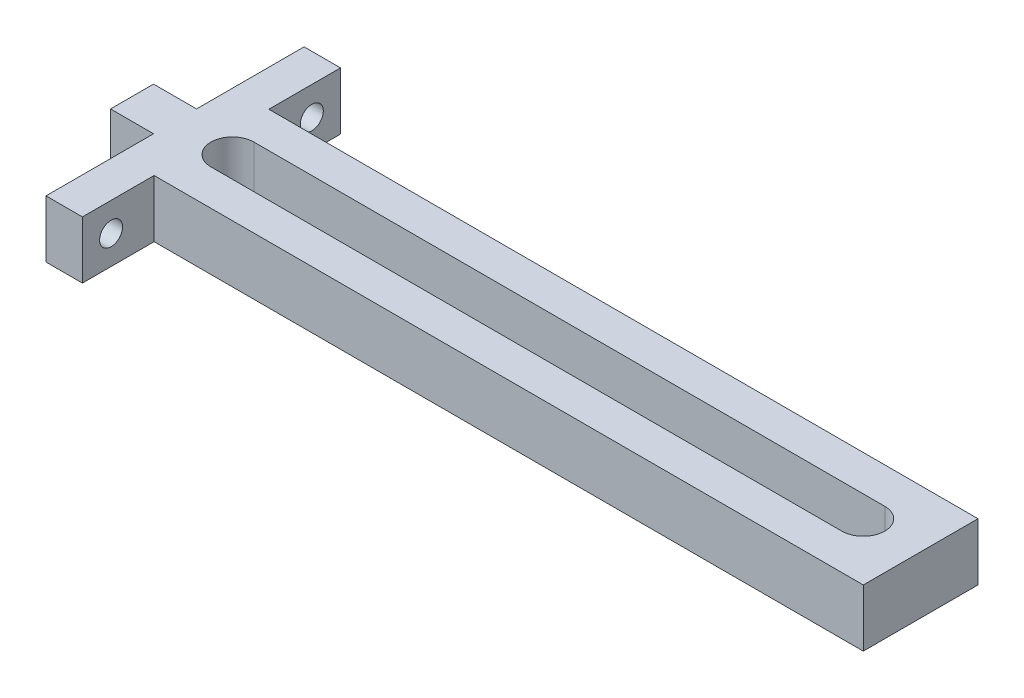
ISO-10303-21;
HEADER;
FILE_DESCRIPTION(('STEP AP214'),'2;1');
FILE_NAME('part.step','',(''),(''),'','','');
FILE_SCHEMA(('AUTOMOTIVE_DESIGN { 1 0 10303 214 1 1 1 1 }'));
ENDSEC;
DATA;
#1=APPLICATION_CONTEXT('core data for automotive mechanical design processes');
#2=APPLICATION_PROTOCOL_DEFINITION('international standard','automotive_design',2000,#1);
#3=PRODUCT_CONTEXT('',#1,'mechanical');
#4=PRODUCT('Part','Part','',(#3));
#5=PRODUCT_RELATED_PRODUCT_CATEGORY('part','',(#4));
#6=PRODUCT_DEFINITION_FORMATION('','',#4);
#7=PRODUCT_DEFINITION_CONTEXT('part definition',#1,'design');
#8=PRODUCT_DEFINITION('design','',#6,#7);
#9=PRODUCT_DEFINITION_SHAPE('','',#8);
#10=(LENGTH_UNIT() NAMED_UNIT(*) SI_UNIT(.MILLI.,.METRE.));
#11=(NAMED_UNIT(*) PLANE_ANGLE_UNIT() SI_UNIT($,.RADIAN.));
#12=(NAMED_UNIT(*) SI_UNIT($,.STERADIAN.) SOLID_ANGLE_UNIT());
#13=UNCERTAINTY_MEASURE_WITH_UNIT(LENGTH_MEASURE(1.E-05),#10,'distance_accuracy_value','');
#14=(GEOMETRIC_REPRESENTATION_CONTEXT(3) GLOBAL_UNCERTAINTY_ASSIGNED_CONTEXT((#13)) GLOBAL_UNIT_ASSIGNED_CONTEXT((#10,
#11,#12)) REPRESENTATION_CONTEXT('',''));
#15=CARTESIAN_POINT('',(0.,0.,0.));
#16=DIRECTION('',(0.,0.,1.));
#17=DIRECTION('',(1.,0.,0.));
#18=AXIS2_PLACEMENT_3D('',#15,#16,#17);
#19=CARTESIAN_POINT('',(-110.,20.,0.));
#20=DIRECTION('',(0.,-1.,0.));
#21=DIRECTION('',(0.,0.,-1.));
#22=AXIS2_PLACEMENT_3D('',#19,#20,#21);
#23=CYLINDRICAL_SURFACE('',#22,7.49999999999996);
#24=CARTESIAN_POINT('',(-110.,0.,0.));
#25=DIRECTION('',(0.,1.,0.));
#26=DIRECTION('',(0.,0.,1.));
#27=AXIS2_PLACEMENT_3D('',#24,#25,#26);
#28=CIRCLE('',#27,7.49999999999996);
#29=CARTESIAN_POINT('',(-110.,0.,-7.49999999999992));
#30=VERTEX_POINT('',#29);
#31=CARTESIAN_POINT('',(-110.,0.,7.49999999999999));
#32=VERTEX_POINT('',#31);
#33=EDGE_CURVE('E214',#30,#32,#28,.T.);
#34=ORIENTED_EDGE('',*,*,#33,.F.);
#35=DIRECTION('',(0.,-1.,0.));
#36=VECTOR('',#35,1.);
#37=CARTESIAN_POINT('',(-110.,20.,-7.49999999999992));
#38=LINE('',#37,#36);
#39=CARTESIAN_POINT('',(-110.,20.,-7.49999999999992));
#40=VERTEX_POINT('',#39);
#41=EDGE_CURVE('E11',#40,#30,#38,.T.);
#42=ORIENTED_EDGE('',*,*,#41,.F.);
#43=CARTESIAN_POINT('',(-110.,20.,0.));
#44=DIRECTION('',(0.,1.,0.));
#45=DIRECTION('',(0.,0.,1.));
#46=AXIS2_PLACEMENT_3D('',#43,#44,#45);
#47=CIRCLE('',#46,7.49999999999996);
#48=CARTESIAN_POINT('',(-110.,20.,7.49999999999999));
#49=VERTEX_POINT('',#48);
#50=EDGE_CURVE('E172',#40,#49,#47,.T.);
#51=ORIENTED_EDGE('',*,*,#50,.T.);
#52=DIRECTION('',(0.,-1.,0.));
#53=VECTOR('',#52,1.);
#54=CARTESIAN_POINT('',(-110.,20.,7.49999999999999));
#55=LINE('',#54,#53);
#56=EDGE_CURVE('E112',#49,#32,#55,.T.);
#57=ORIENTED_EDGE('',*,*,#56,.T.);
#58=EDGE_LOOP('',(#34,#42,#51,#57));
#59=FACE_BOUND('',#58,.T.);
#60=ADVANCED_FACE('F35',(#59),#23,.F.);
#61=CARTESIAN_POINT('',(0.,20.,-7.49999999999996));
#62=DIRECTION('',(0.,0.,1.));
#63=DIRECTION('',(1.,0.,0.));
#64=AXIS2_PLACEMENT_3D('',#61,#62,#63);
#65=PLANE('',#64);
#66=DIRECTION('',(-1.,0.,0.));
#67=VECTOR('',#66,1.);
#68=CARTESIAN_POINT('',(0.,0.,-7.49999999999996));
#69=LINE('',#68,#67);
#70=CARTESIAN_POINT('',(110.,0.,-7.49999999999999));
#71=VERTEX_POINT('',#70);
#72=EDGE_CURVE('E164',#71,#30,#69,.T.);
#73=ORIENTED_EDGE('',*,*,#72,.F.);
#74=DIRECTION('',(0.,-1.,0.));
#75=VECTOR('',#74,1.);
#76=CARTESIAN_POINT('',(110.,20.,-7.49999999999999));
#77=LINE('',#76,#75);
#78=CARTESIAN_POINT('',(110.,20.,-7.49999999999999));
#79=VERTEX_POINT('',#78);
#80=EDGE_CURVE('E45',#79,#71,#77,.T.);
#81=ORIENTED_EDGE('',*,*,#80,.F.);
#82=DIRECTION('',(-1.,0.,0.));
#83=VECTOR('',#82,1.);
#84=CARTESIAN_POINT('',(0.,20.,-7.49999999999996));
#85=LINE('',#84,#83);
#86=EDGE_CURVE('E162',#79,#40,#85,.T.);
#87=ORIENTED_EDGE('',*,*,#86,.T.);
#88=ORIENTED_EDGE('',*,*,#41,.T.);
#89=EDGE_LOOP('',(#73,#81,#87,#88));
#90=FACE_BOUND('',#89,.T.);
#91=ADVANCED_FACE('F161',(#90),#65,.T.);
#92=CARTESIAN_POINT('',(110.,20.,0.));
#93=DIRECTION('',(0.,-1.,0.));
#94=DIRECTION('',(0.,0.,-1.));
#95=AXIS2_PLACEMENT_3D('',#92,#93,#94);
#96=CYLINDRICAL_SURFACE('',#95,7.49999999999996);
#97=CARTESIAN_POINT('',(110.,0.,0.));
#98=DIRECTION('',(0.,1.,0.));
#99=DIRECTION('',(0.,0.,1.));
#100=AXIS2_PLACEMENT_3D('',#97,#98,#99);
#101=CIRCLE('',#100,7.49999999999996);
#102=CARTESIAN_POINT('',(110.,0.,7.49999999999993));
#103=VERTEX_POINT('',#102);
#104=EDGE_CURVE('E218',#103,#71,#101,.T.);
#105=ORIENTED_EDGE('',*,*,#104,.F.);
#106=DIRECTION('',(0.,-1.,0.));
#107=VECTOR('',#106,1.);
#108=CARTESIAN_POINT('',(110.,20.,7.49999999999993));
#109=LINE('',#108,#107);
#110=CARTESIAN_POINT('',(110.,20.,7.49999999999993));
#111=VERTEX_POINT('',#110);
#112=EDGE_CURVE('E105',#111,#103,#109,.T.);
#113=ORIENTED_EDGE('',*,*,#112,.F.);
#114=CARTESIAN_POINT('',(110.,20.,0.));
#115=DIRECTION('',(0.,1.,0.));
#116=DIRECTION('',(0.,0.,1.));
#117=AXIS2_PLACEMENT_3D('',#114,#115,#116);
#118=CIRCLE('',#117,7.49999999999996);
#119=EDGE_CURVE('E171',#111,#79,#118,.T.);
#120=ORIENTED_EDGE('',*,*,#119,.T.);
#121=ORIENTED_EDGE('',*,*,#80,.T.);
#122=EDGE_LOOP('',(#105,#113,#120,#121));
#123=FACE_BOUND('',#122,.T.);
#124=ADVANCED_FACE('F174',(#123),#96,.F.);
#125=CARTESIAN_POINT('',(0.,20.,-20.));
#126=DIRECTION('',(0.,0.,1.));
#127=DIRECTION('',(1.,0.,0.));
#128=AXIS2_PLACEMENT_3D('',#125,#126,#127);
#129=PLANE('',#128);
#130=DIRECTION('',(-1.,0.,0.));
#131=VECTOR('',#130,1.);
#132=CARTESIAN_POINT('',(0.,0.,-20.));
#133=LINE('',#132,#131);
#134=CARTESIAN_POINT('',(130.,0.,-20.0000000000001));
#135=VERTEX_POINT('',#134);
#136=CARTESIAN_POINT('',(-117.3,0.,-20.));
#137=VERTEX_POINT('',#136);
#138=EDGE_CURVE('E180',#135,#137,#133,.T.);
#139=ORIENTED_EDGE('',*,*,#138,.T.);
#140=DIRECTION('',(0.,-1.,0.));
#141=VECTOR('',#140,1.);
#142=CARTESIAN_POINT('',(-117.3,20.,-20.));
#143=LINE('',#142,#141);
#144=CARTESIAN_POINT('',(-117.3,20.,-20.));
#145=VERTEX_POINT('',#144);
#146=EDGE_CURVE('E39',#145,#137,#143,.T.);
#147=ORIENTED_EDGE('',*,*,#146,.F.);
#148=DIRECTION('',(-1.,0.,0.));
#149=VECTOR('',#148,1.);
#150=CARTESIAN_POINT('',(0.,20.,-20.));
#151=LINE('',#150,#149);
#152=CARTESIAN_POINT('',(130.,20.,-20.0000000000001));
#153=VERTEX_POINT('',#152);
#154=EDGE_CURVE('E222',#153,#145,#151,.T.);
#155=ORIENTED_EDGE('',*,*,#154,.F.);
#156=DIRECTION('',(0.,-1.,0.));
#157=VECTOR('',#156,1.);
#158=CARTESIAN_POINT('',(130.,20.,-20.0000000000001));
#159=LINE('',#158,#157);
#160=EDGE_CURVE('E176',#153,#135,#159,.T.);
#161=ORIENTED_EDGE('',*,*,#160,.T.);
#162=EDGE_LOOP('',(#139,#147,#155,#161));
#163=FACE_BOUND('',#162,.T.);
#164=ADVANCED_FACE('F37',(#163),#129,.F.);
#165=CARTESIAN_POINT('',(-117.3,20.,0.));
#166=DIRECTION('',(-1.,0.,0.));
#167=DIRECTION('',(0.,0.,1.));
#168=AXIS2_PLACEMENT_3D('',#165,#166,#167);
#169=PLANE('',#168);
#170=CARTESIAN_POINT('',(-117.3,10.,-35.));
#171=DIRECTION('',(-1.,0.,0.));
#172=DIRECTION('',(0.,0.,1.));
#173=AXIS2_PLACEMENT_3D('',#170,#171,#172);
#174=CIRCLE('',#173,4.);
#175=CARTESIAN_POINT('',(-117.3,10.,-31.));
#176=VERTEX_POINT('',#175);
#177=EDGE_CURVE('E184',#176,#176,#174,.T.);
#178=ORIENTED_EDGE('',*,*,#177,.T.);
#179=EDGE_LOOP('',(#178));
#180=FACE_BOUND('',#179,.T.);
#181=DIRECTION('',(0.,0.,-1.));
#182=VECTOR('',#181,1.);
#183=CARTESIAN_POINT('',(-117.3,0.,0.));
#184=LINE('',#183,#182);
#185=CARTESIAN_POINT('',(-117.3,0.,-45.));
#186=VERTEX_POINT('',#185);
#187=EDGE_CURVE('E183',#137,#186,#184,.T.);
#188=ORIENTED_EDGE('',*,*,#187,.T.);
#189=DIRECTION('',(0.,-1.,0.));
#190=VECTOR('',#189,1.);
#191=CARTESIAN_POINT('',(-117.3,20.,-45.));
#192=LINE('',#191,#190);
#193=CARTESIAN_POINT('',(-117.3,20.,-45.));
#194=VERTEX_POINT('',#193);
#195=EDGE_CURVE('E244',#194,#186,#192,.T.);
#196=ORIENTED_EDGE('',*,*,#195,.F.);
#197=DIRECTION('',(0.,0.,-1.));
#198=VECTOR('',#197,1.);
#199=CARTESIAN_POINT('',(-117.3,20.,0.));
#200=LINE('',#199,#198);
#201=EDGE_CURVE('E120',#145,#194,#200,.T.);
#202=ORIENTED_EDGE('',*,*,#201,.F.);
#203=ORIENTED_EDGE('',*,*,#146,.T.);
#204=EDGE_LOOP('',(#188,#196,#202,#203));
#205=FACE_BOUND('',#204,.T.);
#206=ADVANCED_FACE('F249',(#180,#205),#169,.F.);
#207=CARTESIAN_POINT('',(0.,20.,-45.));
#208=DIRECTION('',(0.,0.,-1.));
#209=DIRECTION('',(-1.,0.,0.));
#210=AXIS2_PLACEMENT_3D('',#207,#208,#209);
#211=PLANE('',#210);
#212=DIRECTION('',(1.,0.,0.));
#213=VECTOR('',#212,1.);
#214=CARTESIAN_POINT('',(0.,0.,-45.));
#215=LINE('',#214,#213);
#216=CARTESIAN_POINT('',(-130.,0.,-45.));
#217=VERTEX_POINT('',#216);
#218=EDGE_CURVE('E187',#217,#186,#215,.T.);
#219=ORIENTED_EDGE('',*,*,#218,.F.);
#220=DIRECTION('',(0.,-1.,0.));
#221=VECTOR('',#220,1.);
#222=CARTESIAN_POINT('',(-130.,20.,-45.));
#223=LINE('',#222,#221);
#224=CARTESIAN_POINT('',(-130.,20.,-45.));
#225=VERTEX_POINT('',#224);
#226=EDGE_CURVE('E243',#225,#217,#223,.T.);
#227=ORIENTED_EDGE('',*,*,#226,.F.);
#228=DIRECTION('',(1.,0.,0.));
#229=VECTOR('',#228,1.);
#230=CARTESIAN_POINT('',(0.,20.,-45.));
#231=LINE('',#230,#229);
#232=EDGE_CURVE('E263',#225,#194,#231,.T.);
#233=ORIENTED_EDGE('',*,*,#232,.T.);
#234=ORIENTED_EDGE('',*,*,#195,.T.);
#235=EDGE_LOOP('',(#219,#227,#233,#234));
#236=FACE_BOUND('',#235,.T.);
#237=ADVANCED_FACE('F261',(#236),#211,.T.);
#238=CARTESIAN_POINT('',(-130.,20.,0.));
#239=DIRECTION('',(-1.,0.,0.));
#240=DIRECTION('',(0.,0.,1.));
#241=AXIS2_PLACEMENT_3D('',#238,#239,#240);
#242=PLANE('',#241);
#243=CARTESIAN_POINT('',(-130.,10.,-35.));
#244=DIRECTION('',(-1.,0.,0.));
#245=DIRECTION('',(0.,0.,1.));
#246=AXIS2_PLACEMENT_3D('',#243,#244,#245);
#247=CIRCLE('',#246,4.);
#248=CARTESIAN_POINT('',(-130.,10.,-31.));
#249=VERTEX_POINT('',#248);
#250=EDGE_CURVE('E353',#249,#249,#247,.T.);
#251=ORIENTED_EDGE('',*,*,#250,.F.);
#252=EDGE_LOOP('',(#251));
#253=FACE_BOUND('',#252,.T.);
#254=DIRECTION('',(0.,0.,-1.));
#255=VECTOR('',#254,1.);
#256=CARTESIAN_POINT('',(-130.,0.,0.));
#257=LINE('',#256,#255);
#258=CARTESIAN_POINT('',(-130.,0.,-7.50000000000005));
#259=VERTEX_POINT('',#258);
#260=EDGE_CURVE('E190',#259,#217,#257,.T.);
#261=ORIENTED_EDGE('',*,*,#260,.F.);
#262=DIRECTION('',(0.,-1.,0.));
#263=VECTOR('',#262,1.);
#264=CARTESIAN_POINT('',(-130.,20.,-7.50000000000005));
#265=LINE('',#264,#263);
#266=CARTESIAN_POINT('',(-130.,20.,-7.50000000000005));
#267=VERTEX_POINT('',#266);
#268=EDGE_CURVE('E241',#267,#259,#265,.T.);
#269=ORIENTED_EDGE('',*,*,#268,.F.);
#270=DIRECTION('',(0.,0.,-1.));
#271=VECTOR('',#270,1.);
#272=CARTESIAN_POINT('',(-130.,20.,0.));
#273=LINE('',#272,#271);
#274=EDGE_CURVE('E268',#267,#225,#273,.T.);
#275=ORIENTED_EDGE('',*,*,#274,.T.);
#276=ORIENTED_EDGE('',*,*,#226,.T.);
#277=EDGE_LOOP('',(#261,#269,#275,#276));
#278=FACE_BOUND('',#277,.T.);
#279=ADVANCED_FACE('F270',(#253,#278),#242,.T.);
#280=CARTESIAN_POINT('',(0.,20.,-7.50000000000006));
#281=DIRECTION('',(0.,0.,1.));
#282=DIRECTION('',(1.,0.,0.));
#283=AXIS2_PLACEMENT_3D('',#280,#281,#282);
#284=PLANE('',#283);
#285=DIRECTION('',(-1.,0.,0.));
#286=VECTOR('',#285,1.);
#287=CARTESIAN_POINT('',(0.,0.,-7.50000000000006));
#288=LINE('',#287,#286);
#289=CARTESIAN_POINT('',(-145.,0.,-7.50000000000005));
#290=VERTEX_POINT('',#289);
#291=EDGE_CURVE('E193',#259,#290,#288,.T.);
#292=ORIENTED_EDGE('',*,*,#291,.T.);
#293=DIRECTION('',(0.,-1.,0.));
#294=VECTOR('',#293,1.);
#295=CARTESIAN_POINT('',(-145.,20.,-7.50000000000005));
#296=LINE('',#295,#294);
#297=CARTESIAN_POINT('',(-145.,20.,-7.50000000000005));
#298=VERTEX_POINT('',#297);
#299=EDGE_CURVE('E239',#298,#290,#296,.T.);
#300=ORIENTED_EDGE('',*,*,#299,.F.);
#301=DIRECTION('',(-1.,0.,0.));
#302=VECTOR('',#301,1.);
#303=CARTESIAN_POINT('',(0.,20.,-7.50000000000006));
#304=LINE('',#303,#302);
#305=EDGE_CURVE('E272',#267,#298,#304,.T.);
#306=ORIENTED_EDGE('',*,*,#305,.F.);
#307=ORIENTED_EDGE('',*,*,#268,.T.);
#308=EDGE_LOOP('',(#292,#300,#306,#307));
#309=FACE_BOUND('',#308,.T.);
#310=ADVANCED_FACE('F339',(#309),#284,.F.);
#311=CARTESIAN_POINT('',(-145.,20.,0.));
#312=DIRECTION('',(-1.,0.,0.));
#313=DIRECTION('',(0.,0.,1.));
#314=AXIS2_PLACEMENT_3D('',#311,#312,#313);
#315=PLANE('',#314);
#316=DIRECTION('',(0.,0.,-1.));
#317=VECTOR('',#316,1.);
#318=CARTESIAN_POINT('',(-145.,0.,0.));
#319=LINE('',#318,#317);
#320=CARTESIAN_POINT('',(-145.,0.,7.49999999999997));
#321=VERTEX_POINT('',#320);
#322=EDGE_CURVE('E197',#321,#290,#319,.T.);
#323=ORIENTED_EDGE('',*,*,#322,.F.);
#324=DIRECTION('',(0.,-1.,0.));
#325=VECTOR('',#324,1.);
#326=CARTESIAN_POINT('',(-145.,20.,7.49999999999997));
#327=LINE('',#326,#325);
#328=CARTESIAN_POINT('',(-145.,20.,7.49999999999997));
#329=VERTEX_POINT('',#328);
#330=EDGE_CURVE('E237',#329,#321,#327,.T.);
#331=ORIENTED_EDGE('',*,*,#330,.F.);
#332=DIRECTION('',(0.,0.,-1.));
#333=VECTOR('',#332,1.);
#334=CARTESIAN_POINT('',(-145.,20.,0.));
#335=LINE('',#334,#333);
#336=EDGE_CURVE('E275',#329,#298,#335,.T.);
#337=ORIENTED_EDGE('',*,*,#336,.T.);
#338=ORIENTED_EDGE('',*,*,#299,.T.);
#339=EDGE_LOOP('',(#323,#331,#337,#338));
#340=FACE_BOUND('',#339,.T.);
#341=ADVANCED_FACE('F336',(#340),#315,.T.);
#342=CARTESIAN_POINT('',(0.,20.,7.49999999999997));
#343=DIRECTION('',(0.,0.,1.));
#344=DIRECTION('',(1.,0.,0.));
#345=AXIS2_PLACEMENT_3D('',#342,#343,#344);
#346=PLANE('',#345);
#347=DIRECTION('',(-1.,0.,0.));
#348=VECTOR('',#347,1.);
#349=CARTESIAN_POINT('',(0.,0.,7.49999999999997));
#350=LINE('',#349,#348);
#351=CARTESIAN_POINT('',(-130.,0.,7.49999999999997));
#352=VERTEX_POINT('',#351);
#353=EDGE_CURVE('E200',#352,#321,#350,.T.);
#354=ORIENTED_EDGE('',*,*,#353,.F.);
#355=DIRECTION('',(0.,-1.,0.));
#356=VECTOR('',#355,1.);
#357=CARTESIAN_POINT('',(-130.,20.,7.49999999999997));
#358=LINE('',#357,#356);
#359=CARTESIAN_POINT('',(-130.,20.,7.49999999999997));
#360=VERTEX_POINT('',#359);
#361=EDGE_CURVE('E235',#360,#352,#358,.T.);
#362=ORIENTED_EDGE('',*,*,#361,.F.);
#363=DIRECTION('',(-1.,0.,0.));
#364=VECTOR('',#363,1.);
#365=CARTESIAN_POINT('',(0.,20.,7.49999999999997));
#366=LINE('',#365,#364);
#367=EDGE_CURVE('E279',#360,#329,#366,.T.);
#368=ORIENTED_EDGE('',*,*,#367,.T.);
#369=ORIENTED_EDGE('',*,*,#330,.T.);
#370=EDGE_LOOP('',(#354,#362,#368,#369));
#371=FACE_BOUND('',#370,.T.);
#372=ADVANCED_FACE('F332',(#371),#346,.T.);
#373=CARTESIAN_POINT('',(-130.,10.,35.));
#374=DIRECTION('',(-1.,0.,0.));
#375=DIRECTION('',(0.,0.,1.));
#376=AXIS2_PLACEMENT_3D('',#373,#374,#375);
#377=CIRCLE('',#376,4.);
#378=CARTESIAN_POINT('',(-130.,10.,39.));
#379=VERTEX_POINT('',#378);
#380=EDGE_CURVE('E359',#379,#379,#377,.T.);
#381=ORIENTED_EDGE('',*,*,#380,.F.);
#382=EDGE_LOOP('',(#381));
#383=FACE_BOUND('',#382,.T.);
#384=CARTESIAN_POINT('',(-130.,0.,45.));
#385=VERTEX_POINT('',#384);
#386=EDGE_CURVE('E194',#385,#352,#257,.T.);
#387=ORIENTED_EDGE('',*,*,#386,.F.);
#388=DIRECTION('',(0.,-1.,0.));
#389=VECTOR('',#388,1.);
#390=CARTESIAN_POINT('',(-130.,20.,45.));
#391=LINE('',#390,#389);
#392=CARTESIAN_POINT('',(-130.,20.,45.));
#393=VERTEX_POINT('',#392);
#394=EDGE_CURVE('E233',#393,#385,#391,.T.);
#395=ORIENTED_EDGE('',*,*,#394,.F.);
#396=EDGE_CURVE('E274',#393,#360,#273,.T.);
#397=ORIENTED_EDGE('',*,*,#396,.T.);
#398=ORIENTED_EDGE('',*,*,#361,.T.);
#399=EDGE_LOOP('',(#387,#395,#397,#398));
#400=FACE_BOUND('',#399,.T.);
#401=ADVANCED_FACE('F328',(#383,#400),#242,.T.);
#402=CARTESIAN_POINT('',(0.,20.,45.));
#403=DIRECTION('',(0.,0.,-1.));
#404=DIRECTION('',(-1.,0.,0.));
#405=AXIS2_PLACEMENT_3D('',#402,#403,#404);
#406=PLANE('',#405);
#407=DIRECTION('',(1.,0.,0.));
#408=VECTOR('',#407,1.);
#409=CARTESIAN_POINT('',(0.,0.,45.));
#410=LINE('',#409,#408);
#411=CARTESIAN_POINT('',(-117.3,0.,45.));
#412=VERTEX_POINT('',#411);
#413=EDGE_CURVE('E203',#385,#412,#410,.T.);
#414=ORIENTED_EDGE('',*,*,#413,.T.);
#415=DIRECTION('',(0.,-1.,0.));
#416=VECTOR('',#415,1.);
#417=CARTESIAN_POINT('',(-117.3,20.,45.));
#418=LINE('',#417,#416);
#419=CARTESIAN_POINT('',(-117.3,20.,45.));
#420=VERTEX_POINT('',#419);
#421=EDGE_CURVE('E231',#420,#412,#418,.T.);
#422=ORIENTED_EDGE('',*,*,#421,.F.);
#423=DIRECTION('',(1.,0.,0.));
#424=VECTOR('',#423,1.);
#425=CARTESIAN_POINT('',(0.,20.,45.));
#426=LINE('',#425,#424);
#427=EDGE_CURVE('E278',#393,#420,#426,.T.);
#428=ORIENTED_EDGE('',*,*,#427,.F.);
#429=ORIENTED_EDGE('',*,*,#394,.T.);
#430=EDGE_LOOP('',(#414,#422,#428,#429));
#431=FACE_BOUND('',#430,.T.);
#432=ADVANCED_FACE('F324',(#431),#406,.F.);
#433=CARTESIAN_POINT('',(-117.3,20.,0.));
#434=DIRECTION('',(1.,0.,0.));
#435=DIRECTION('',(0.,0.,-1.));
#436=AXIS2_PLACEMENT_3D('',#433,#434,#435);
#437=PLANE('',#436);
#438=CARTESIAN_POINT('',(-117.3,10.,35.));
#439=DIRECTION('',(-1.,0.,0.));
#440=DIRECTION('',(0.,0.,1.));
#441=AXIS2_PLACEMENT_3D('',#438,#439,#440);
#442=CIRCLE('',#441,4.);
#443=CARTESIAN_POINT('',(-117.3,10.,39.));
#444=VERTEX_POINT('',#443);
#445=EDGE_CURVE('E356',#444,#444,#442,.T.);
#446=ORIENTED_EDGE('',*,*,#445,.T.);
#447=EDGE_LOOP('',(#446));
#448=FACE_BOUND('',#447,.T.);
#449=DIRECTION('',(0.,0.,1.));
#450=VECTOR('',#449,1.);
#451=CARTESIAN_POINT('',(-117.3,0.,0.));
#452=LINE('',#451,#450);
#453=CARTESIAN_POINT('',(-117.3,0.,20.));
#454=VERTEX_POINT('',#453);
#455=EDGE_CURVE('E206',#454,#412,#452,.T.);
#456=ORIENTED_EDGE('',*,*,#455,.F.);
#457=DIRECTION('',(0.,-1.,0.));
#458=VECTOR('',#457,1.);
#459=CARTESIAN_POINT('',(-117.3,20.,20.));
#460=LINE('',#459,#458);
#461=CARTESIAN_POINT('',(-117.3,20.,20.));
#462=VERTEX_POINT('',#461);
#463=EDGE_CURVE('E229',#462,#454,#460,.T.);
#464=ORIENTED_EDGE('',*,*,#463,.F.);
#465=DIRECTION('',(0.,0.,1.));
#466=VECTOR('',#465,1.);
#467=CARTESIAN_POINT('',(-117.3,20.,0.));
#468=LINE('',#467,#466);
#469=EDGE_CURVE('E282',#462,#420,#468,.T.);
#470=ORIENTED_EDGE('',*,*,#469,.T.);
#471=ORIENTED_EDGE('',*,*,#421,.T.);
#472=EDGE_LOOP('',(#456,#464,#470,#471));
#473=FACE_BOUND('',#472,.T.);
#474=ADVANCED_FACE('F320',(#448,#473),#437,.T.);
#475=CARTESIAN_POINT('',(0.,20.,20.));
#476=DIRECTION('',(0.,0.,1.));
#477=DIRECTION('',(1.,0.,0.));
#478=AXIS2_PLACEMENT_3D('',#475,#476,#477);
#479=PLANE('',#478);
#480=DIRECTION('',(-1.,0.,0.));
#481=VECTOR('',#480,1.);
#482=CARTESIAN_POINT('',(0.,0.,20.));
#483=LINE('',#482,#481);
#484=CARTESIAN_POINT('',(130.,0.,19.9999999999999));
#485=VERTEX_POINT('',#484);
#486=EDGE_CURVE('E209',#485,#454,#483,.T.);
#487=ORIENTED_EDGE('',*,*,#486,.F.);
#488=DIRECTION('',(0.,-1.,0.));
#489=VECTOR('',#488,1.);
#490=CARTESIAN_POINT('',(130.,20.,19.9999999999999));
#491=LINE('',#490,#489);
#492=CARTESIAN_POINT('',(130.,20.,19.9999999999999));
#493=VERTEX_POINT('',#492);
#494=EDGE_CURVE('E227',#493,#485,#491,.T.);
#495=ORIENTED_EDGE('',*,*,#494,.F.);
#496=DIRECTION('',(-1.,0.,0.));
#497=VECTOR('',#496,1.);
#498=CARTESIAN_POINT('',(0.,20.,20.));
#499=LINE('',#498,#497);
#500=EDGE_CURVE('E293',#493,#462,#499,.T.);
#501=ORIENTED_EDGE('',*,*,#500,.T.);
#502=ORIENTED_EDGE('',*,*,#463,.T.);
#503=EDGE_LOOP('',(#487,#495,#501,#502));
#504=FACE_BOUND('',#503,.T.);
#505=ADVANCED_FACE('F306',(#504),#479,.T.);
#506=CARTESIAN_POINT('',(130.,20.,0.));
#507=DIRECTION('',(-1.,0.,0.));
#508=DIRECTION('',(0.,0.,1.));
#509=AXIS2_PLACEMENT_3D('',#506,#507,#508);
#510=PLANE('',#509);
#511=DIRECTION('',(0.,0.,-1.));
#512=VECTOR('',#511,1.);
#513=CARTESIAN_POINT('',(130.,0.,0.));
#514=LINE('',#513,#512);
#515=EDGE_CURVE('E212',#485,#135,#514,.T.);
#516=ORIENTED_EDGE('',*,*,#515,.T.);
#517=ORIENTED_EDGE('',*,*,#160,.F.);
#518=DIRECTION('',(0.,0.,-1.));
#519=VECTOR('',#518,1.);
#520=CARTESIAN_POINT('',(130.,20.,0.));
#521=LINE('',#520,#519);
#522=EDGE_CURVE('E296',#493,#153,#521,.T.);
#523=ORIENTED_EDGE('',*,*,#522,.F.);
#524=ORIENTED_EDGE('',*,*,#494,.T.);
#525=EDGE_LOOP('',(#516,#517,#523,#524));
#526=FACE_BOUND('',#525,.T.);
#527=ADVANCED_FACE('F299',(#526),#510,.F.);
#528=CARTESIAN_POINT('',(0.,20.,7.49999999999996));
#529=DIRECTION('',(0.,0.,1.));
#530=DIRECTION('',(1.,0.,0.));
#531=AXIS2_PLACEMENT_3D('',#528,#529,#530);
#532=PLANE('',#531);
#533=DIRECTION('',(-1.,0.,0.));
#534=VECTOR('',#533,1.);
#535=CARTESIAN_POINT('',(0.,0.,7.49999999999996));
#536=LINE('',#535,#534);
#537=EDGE_CURVE('E220',#103,#32,#536,.T.);
#538=ORIENTED_EDGE('',*,*,#537,.T.);
#539=ORIENTED_EDGE('',*,*,#56,.F.);
#540=DIRECTION('',(-1.,0.,0.));
#541=VECTOR('',#540,1.);
#542=CARTESIAN_POINT('',(0.,20.,7.49999999999996));
#543=LINE('',#542,#541);
#544=EDGE_CURVE('E54',#111,#49,#543,.T.);
#545=ORIENTED_EDGE('',*,*,#544,.F.);
#546=ORIENTED_EDGE('',*,*,#112,.T.);
#547=EDGE_LOOP('',(#538,#539,#545,#546));
#548=FACE_BOUND('',#547,.T.);
#549=ADVANCED_FACE('F297',(#548),#532,.F.);
#550=CARTESIAN_POINT('',(0.,20.,0.));
#551=DIRECTION('',(0.,1.,0.));
#552=DIRECTION('',(0.,0.,1.));
#553=AXIS2_PLACEMENT_3D('',#550,#551,#552);
#554=PLANE('',#553);
#555=ORIENTED_EDGE('',*,*,#154,.T.);
#556=ORIENTED_EDGE('',*,*,#201,.T.);
#557=ORIENTED_EDGE('',*,*,#232,.F.);
#558=ORIENTED_EDGE('',*,*,#274,.F.);
#559=ORIENTED_EDGE('',*,*,#305,.T.);
#560=ORIENTED_EDGE('',*,*,#336,.F.);
#561=ORIENTED_EDGE('',*,*,#367,.F.);
#562=ORIENTED_EDGE('',*,*,#396,.F.);
#563=ORIENTED_EDGE('',*,*,#427,.T.);
#564=ORIENTED_EDGE('',*,*,#469,.F.);
#565=ORIENTED_EDGE('',*,*,#500,.F.);
#566=ORIENTED_EDGE('',*,*,#522,.T.);
#567=EDGE_LOOP('',(#555,#556,#557,#558,#559,#560,#561,#562,#563,#564,#565,#566));
#568=FACE_BOUND('',#567,.T.);
#569=ORIENTED_EDGE('',*,*,#50,.F.);
#570=ORIENTED_EDGE('',*,*,#86,.F.);
#571=ORIENTED_EDGE('',*,*,#119,.F.);
#572=ORIENTED_EDGE('',*,*,#544,.T.);
#573=EDGE_LOOP('',(#569,#570,#571,#572));
#574=FACE_BOUND('',#573,.T.);
#575=ADVANCED_FACE('F170',(#568,#574),#554,.T.);
#576=CARTESIAN_POINT('',(0.,0.,0.));
#577=DIRECTION('',(0.,1.,0.));
#578=DIRECTION('',(0.,0.,1.));
#579=AXIS2_PLACEMENT_3D('',#576,#577,#578);
#580=PLANE('',#579);
#581=ORIENTED_EDGE('',*,*,#138,.F.);
#582=ORIENTED_EDGE('',*,*,#515,.F.);
#583=ORIENTED_EDGE('',*,*,#486,.T.);
#584=ORIENTED_EDGE('',*,*,#455,.T.);
#585=ORIENTED_EDGE('',*,*,#413,.F.);
#586=ORIENTED_EDGE('',*,*,#386,.T.);
#587=ORIENTED_EDGE('',*,*,#353,.T.);
#588=ORIENTED_EDGE('',*,*,#322,.T.);
#589=ORIENTED_EDGE('',*,*,#291,.F.);
#590=ORIENTED_EDGE('',*,*,#260,.T.);
#591=ORIENTED_EDGE('',*,*,#218,.T.);
#592=ORIENTED_EDGE('',*,*,#187,.F.);
#593=EDGE_LOOP('',(#581,#582,#583,#584,#585,#586,#587,#588,#589,#590,#591,#592));
#594=FACE_BOUND('',#593,.T.);
#595=ORIENTED_EDGE('',*,*,#33,.T.);
#596=ORIENTED_EDGE('',*,*,#537,.F.);
#597=ORIENTED_EDGE('',*,*,#104,.T.);
#598=ORIENTED_EDGE('',*,*,#72,.T.);
#599=EDGE_LOOP('',(#595,#596,#597,#598));
#600=FACE_BOUND('',#599,.T.);
#601=ADVANCED_FACE('F256',(#594,#600),#580,.F.);
#602=CARTESIAN_POINT('',(-117.3,10.,-35.));
#603=DIRECTION('',(-1.,0.,0.));
#604=DIRECTION('',(0.,0.,1.));
#605=AXIS2_PLACEMENT_3D('',#602,#603,#604);
#606=CYLINDRICAL_SURFACE('',#605,4.);
#607=ORIENTED_EDGE('',*,*,#177,.F.);
#608=EDGE_LOOP('',(#607));
#609=FACE_BOUND('',#608,.T.);
#610=ORIENTED_EDGE('',*,*,#250,.T.);
#611=EDGE_LOOP('',(#610));
#612=FACE_BOUND('',#611,.T.);
#613=ADVANCED_FACE('F384',(#609,#612),#606,.F.);
#614=CARTESIAN_POINT('',(-117.3,10.,35.));
#615=DIRECTION('',(-1.,0.,0.));
#616=DIRECTION('',(0.,0.,1.));
#617=AXIS2_PLACEMENT_3D('',#614,#615,#616);
#618=CYLINDRICAL_SURFACE('',#617,4.);
#619=ORIENTED_EDGE('',*,*,#445,.F.);
#620=EDGE_LOOP('',(#619));
#621=FACE_BOUND('',#620,.T.);
#622=ORIENTED_EDGE('',*,*,#380,.T.);
#623=EDGE_LOOP('',(#622));
#624=FACE_BOUND('',#623,.T.);
#625=ADVANCED_FACE('F381',(#621,#624),#618,.F.);
#626=CLOSED_SHELL('',(#60,#91,#124,#164,#206,#237,#279,#310,#341,#372,#401,#432,#474,#505,#527,
#549,#575,#601,#613,#625));
#627=MANIFOLD_SOLID_BREP('B2',#626);
#628=ADVANCED_BREP_SHAPE_REPRESENTATION('',(#18,#627),#14);
#629=SHAPE_DEFINITION_REPRESENTATION(#9,#628);
ENDSEC;
END-ISO-10303-21;
